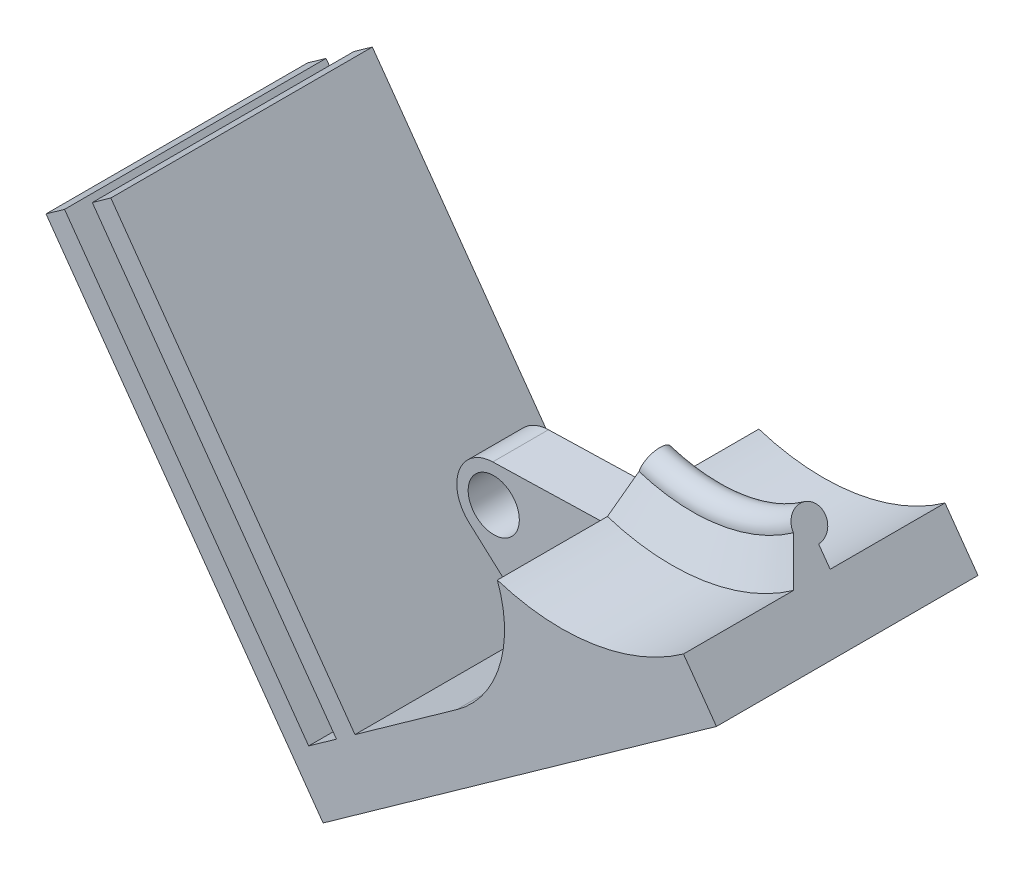
ISO-10303-21;
HEADER;
FILE_DESCRIPTION(('STEP AP214'),'2;1');
FILE_NAME('part.step','',(''),(''),'','','');
FILE_SCHEMA(('AUTOMOTIVE_DESIGN { 1 0 10303 214 1 1 1 1 }'));
ENDSEC;
DATA;
#1=APPLICATION_CONTEXT('core data for automotive mechanical design processes');
#2=APPLICATION_PROTOCOL_DEFINITION('international standard','automotive_design',2000,#1);
#3=PRODUCT_CONTEXT('',#1,'mechanical');
#4=PRODUCT('Part','Part','',(#3));
#5=PRODUCT_RELATED_PRODUCT_CATEGORY('part','',(#4));
#6=PRODUCT_DEFINITION_FORMATION('','',#4);
#7=PRODUCT_DEFINITION_CONTEXT('part definition',#1,'design');
#8=PRODUCT_DEFINITION('design','',#6,#7);
#9=PRODUCT_DEFINITION_SHAPE('','',#8);
#10=(LENGTH_UNIT() NAMED_UNIT(*) SI_UNIT(.MILLI.,.METRE.));
#11=(NAMED_UNIT(*) PLANE_ANGLE_UNIT() SI_UNIT($,.RADIAN.));
#12=(NAMED_UNIT(*) SI_UNIT($,.STERADIAN.) SOLID_ANGLE_UNIT());
#13=UNCERTAINTY_MEASURE_WITH_UNIT(LENGTH_MEASURE(1.E-05),#10,'distance_accuracy_value','');
#14=(GEOMETRIC_REPRESENTATION_CONTEXT(3) GLOBAL_UNCERTAINTY_ASSIGNED_CONTEXT((#13)) GLOBAL_UNIT_ASSIGNED_CONTEXT((#10,
#11,#12)) REPRESENTATION_CONTEXT('',''));
#15=CARTESIAN_POINT('',(0.,0.,0.));
#16=DIRECTION('',(0.,0.,1.));
#17=DIRECTION('',(1.,0.,0.));
#18=AXIS2_PLACEMENT_3D('',#15,#16,#17);
#19=CARTESIAN_POINT('',(0.,0.,23.));
#20=DIRECTION('',(0.,0.,-1.));
#21=DIRECTION('',(-1.,0.,0.));
#22=AXIS2_PLACEMENT_3D('',#19,#20,#21);
#23=CYLINDRICAL_SURFACE('',#22,37.);
#24=DIRECTION('',(0.,0.,-1.));
#25=VECTOR('',#24,1.);
#26=CARTESIAN_POINT('',(-11.2677939684122,-35.2425427443227,4.9));
#27=LINE('',#26,#25);
#28=CARTESIAN_POINT('',(-11.2677939684122,-35.2425427443227,-2.8));
#29=VERTEX_POINT('',#28);
#30=CARTESIAN_POINT('',(-11.2677939684122,-35.2425427443227,-4.9));
#31=VERTEX_POINT('',#30);
#32=EDGE_CURVE('E352',#29,#31,#27,.T.);
#33=ORIENTED_EDGE('',*,*,#32,.F.);
#34=CARTESIAN_POINT('',(0.,0.,-2.8));
#35=DIRECTION('',(0.,0.,1.));
#36=DIRECTION('',(1.,0.,0.));
#37=AXIS2_PLACEMENT_3D('',#34,#35,#36);
#38=CIRCLE('',#37,37.0000000000346);
#39=CARTESIAN_POINT('',(21.4708032995156,-30.1331147689061,-2.8));
#40=VERTEX_POINT('',#39);
#41=EDGE_CURVE('E319',#29,#40,#38,.T.);
#42=ORIENTED_EDGE('',*,*,#41,.T.);
#43=DIRECTION('',(0.,0.,-1.));
#44=VECTOR('',#43,1.);
#45=CARTESIAN_POINT('',(21.4708032994993,-30.1331147688753,23.));
#46=LINE('',#45,#44);
#47=CARTESIAN_POINT('',(21.4708032994993,-30.1331147688753,-23.));
#48=VERTEX_POINT('',#47);
#49=EDGE_CURVE('E397',#40,#48,#46,.T.);
#50=ORIENTED_EDGE('',*,*,#49,.T.);
#51=CARTESIAN_POINT('',(0.,0.,-23.));
#52=DIRECTION('',(0.,0.,1.));
#53=DIRECTION('',(1.,0.,0.));
#54=AXIS2_PLACEMENT_3D('',#51,#52,#53);
#55=CIRCLE('',#54,37.);
#56=CARTESIAN_POINT('',(-11.2677939684122,-35.2425427443227,-23.));
#57=VERTEX_POINT('',#56);
#58=EDGE_CURVE('E374',#57,#48,#55,.T.);
#59=ORIENTED_EDGE('',*,*,#58,.F.);
#60=DIRECTION('',(0.,0.,-1.));
#61=VECTOR('',#60,1.);
#62=CARTESIAN_POINT('',(-11.2677939684122,-35.2425427443227,23.));
#63=LINE('',#62,#61);
#64=EDGE_CURVE('E383',#31,#57,#63,.T.);
#65=ORIENTED_EDGE('',*,*,#64,.F.);
#66=EDGE_LOOP('',(#33,#42,#50,#59,#65));
#67=FACE_BOUND('',#66,.T.);
#68=ADVANCED_FACE('F81',(#67),#23,.F.);
#69=CARTESIAN_POINT('',(21.4708032994993,-30.1331147688753,23.));
#70=VERTEX_POINT('',#69);
#71=CARTESIAN_POINT('',(21.4708032995156,-30.1331147689061,3.63730669591681));
#72=VERTEX_POINT('',#71);
#73=EDGE_CURVE('E398',#70,#72,#46,.T.);
#74=ORIENTED_EDGE('',*,*,#73,.T.);
#75=CARTESIAN_POINT('',(0.,0.,3.63730669591681));
#76=DIRECTION('',(0.,0.,1.));
#77=DIRECTION('',(1.,0.,0.));
#78=AXIS2_PLACEMENT_3D('',#75,#76,#77);
#79=CIRCLE('',#78,37.0000000000346);
#80=CARTESIAN_POINT('',(-11.2677939684225,-35.2425427443557,3.63730669591681));
#81=VERTEX_POINT('',#80);
#82=EDGE_CURVE('E317',#81,#72,#79,.T.);
#83=ORIENTED_EDGE('',*,*,#82,.F.);
#84=CARTESIAN_POINT('',(-11.2677939684122,-35.2425427443227,4.9));
#85=VERTEX_POINT('',#84);
#86=EDGE_CURVE('E353',#85,#81,#27,.T.);
#87=ORIENTED_EDGE('',*,*,#86,.F.);
#88=CARTESIAN_POINT('',(-11.2677939684122,-35.2425427443227,23.));
#89=VERTEX_POINT('',#88);
#90=EDGE_CURVE('E394',#89,#85,#63,.T.);
#91=ORIENTED_EDGE('',*,*,#90,.F.);
#92=CARTESIAN_POINT('',(0.,0.,23.));
#93=DIRECTION('',(0.,0.,1.));
#94=DIRECTION('',(1.,0.,0.));
#95=AXIS2_PLACEMENT_3D('',#92,#93,#94);
#96=CIRCLE('',#95,37.);
#97=EDGE_CURVE('E380',#89,#70,#96,.T.);
#98=ORIENTED_EDGE('',*,*,#97,.T.);
#99=EDGE_LOOP('',(#74,#83,#87,#91,#98));
#100=FACE_BOUND('',#99,.T.);
#101=ADVANCED_FACE('F443',(#100),#23,.F.);
#102=CARTESIAN_POINT('',(-30.,-42.25,23.));
#103=DIRECTION('',(0.,0.,-1.));
#104=DIRECTION('',(-1.,0.,0.));
#105=AXIS2_PLACEMENT_3D('',#102,#103,#104);
#106=CYLINDRICAL_SURFACE('',#105,20.);
#107=DIRECTION('',(0.,0.,-1.));
#108=VECTOR('',#107,1.);
#109=CARTESIAN_POINT('',(-18.394160378649,-58.538170145338,23.));
#110=LINE('',#109,#108);
#111=CARTESIAN_POINT('',(-18.394160378649,-58.538170145338,-4.9));
#112=VERTEX_POINT('',#111);
#113=CARTESIAN_POINT('',(-18.394160378649,-58.538170145338,-23.));
#114=VERTEX_POINT('',#113);
#115=EDGE_CURVE('E89',#112,#114,#110,.T.);
#116=ORIENTED_EDGE('',*,*,#115,.F.);
#117=CARTESIAN_POINT('',(-30.,-42.25,-4.9));
#118=DIRECTION('',(0.,0.,1.));
#119=DIRECTION('',(1.,0.,0.));
#120=AXIS2_PLACEMENT_3D('',#117,#118,#119);
#121=CIRCLE('',#120,20.);
#122=EDGE_CURVE('E344',#112,#31,#121,.T.);
#123=ORIENTED_EDGE('',*,*,#122,.T.);
#124=ORIENTED_EDGE('',*,*,#64,.T.);
#125=CARTESIAN_POINT('',(-30.,-42.25,-23.));
#126=DIRECTION('',(0.,0.,1.));
#127=DIRECTION('',(1.,0.,0.));
#128=AXIS2_PLACEMENT_3D('',#125,#126,#127);
#129=CIRCLE('',#128,20.);
#130=EDGE_CURVE('E373',#114,#57,#129,.T.);
#131=ORIENTED_EDGE('',*,*,#130,.F.);
#132=EDGE_LOOP('',(#116,#123,#124,#131));
#133=FACE_BOUND('',#132,.T.);
#134=ADVANCED_FACE('F405',(#133),#106,.F.);
#135=CARTESIAN_POINT('',(-30.,-42.25,4.9));
#136=DIRECTION('',(0.,0.,1.));
#137=DIRECTION('',(1.,0.,0.));
#138=AXIS2_PLACEMENT_3D('',#135,#136,#137);
#139=CIRCLE('',#138,20.);
#140=CARTESIAN_POINT('',(-18.394160378649,-58.538170145338,4.9));
#141=VERTEX_POINT('',#140);
#142=EDGE_CURVE('E332',#141,#85,#139,.T.);
#143=ORIENTED_EDGE('',*,*,#142,.F.);
#144=CARTESIAN_POINT('',(-18.394160378649,-58.538170145338,23.));
#145=VERTEX_POINT('',#144);
#146=EDGE_CURVE('E12',#145,#141,#110,.T.);
#147=ORIENTED_EDGE('',*,*,#146,.F.);
#148=CARTESIAN_POINT('',(-30.,-42.25,23.));
#149=DIRECTION('',(0.,0.,1.));
#150=DIRECTION('',(1.,0.,0.));
#151=AXIS2_PLACEMENT_3D('',#148,#149,#150);
#152=CIRCLE('',#151,20.);
#153=EDGE_CURVE('E235',#145,#89,#152,.T.);
#154=ORIENTED_EDGE('',*,*,#153,.T.);
#155=ORIENTED_EDGE('',*,*,#90,.T.);
#156=EDGE_LOOP('',(#143,#147,#154,#155));
#157=FACE_BOUND('',#156,.T.);
#158=ADVANCED_FACE('F83',(#157),#106,.F.);
#159=CARTESIAN_POINT('',(21.4708032994993,-30.1331147688753,23.));
#160=DIRECTION('',(-0.58029198106755,0.814408507266899,0.));
#161=DIRECTION('',(-0.814408507266899,-0.58029198106755,0.));
#162=AXIS2_PLACEMENT_3D('',#159,#160,#161);
#163=PLANE('',#162);
#164=DIRECTION('',(0.814408507266899,0.58029198106755,0.));
#165=VECTOR('',#164,1.);
#166=CARTESIAN_POINT('',(21.4708032994993,-30.1331147688753,-23.));
#167=LINE('',#166,#165);
#168=CARTESIAN_POINT('',(-36.3111475385208,-71.3045937288241,-23.));
#169=VERTEX_POINT('',#168);
#170=EDGE_CURVE('E243',#169,#114,#167,.T.);
#171=ORIENTED_EDGE('',*,*,#170,.F.);
#172=DIRECTION('',(0.,0.,-1.));
#173=VECTOR('',#172,1.);
#174=CARTESIAN_POINT('',(-36.3111475385208,-71.3045937288241,23.));
#175=LINE('',#174,#173);
#176=CARTESIAN_POINT('',(-36.3111475385208,-71.3045937288241,23.));
#177=VERTEX_POINT('',#176);
#178=EDGE_CURVE('E240',#177,#169,#175,.T.);
#179=ORIENTED_EDGE('',*,*,#178,.F.);
#180=DIRECTION('',(0.814408507266899,0.58029198106755,0.));
#181=VECTOR('',#180,1.);
#182=CARTESIAN_POINT('',(21.4708032994993,-30.1331147688753,23.));
#183=LINE('',#182,#181);
#184=EDGE_CURVE('E226',#177,#145,#183,.T.);
#185=ORIENTED_EDGE('',*,*,#184,.T.);
#186=ORIENTED_EDGE('',*,*,#146,.T.);
#187=DIRECTION('',(0.,0.,-1.));
#188=VECTOR('',#187,1.);
#189=CARTESIAN_POINT('',(-18.394160378649,-58.538170145338,4.9));
#190=LINE('',#189,#188);
#191=EDGE_CURVE('E360',#112,#141,#190,.F.);
#192=ORIENTED_EDGE('',*,*,#191,.F.);
#193=ORIENTED_EDGE('',*,*,#115,.T.);
#194=EDGE_LOOP('',(#171,#179,#185,#186,#192,#193));
#195=FACE_BOUND('',#194,.T.);
#196=ADVANCED_FACE('F241',(#195),#163,.T.);
#197=CARTESIAN_POINT('',(27.2737231101748,-38.2771998415442,23.));
#198=DIRECTION('',(0.58029198106755,-0.814408507266899,0.));
#199=DIRECTION('',(0.814408507266899,0.58029198106755,0.));
#200=AXIS2_PLACEMENT_3D('',#197,#198,#199);
#201=PLANE('',#200);
#202=DIRECTION('',(-0.814408507266899,-0.58029198106755,0.));
#203=VECTOR('',#202,1.);
#204=CARTESIAN_POINT('',(27.2737231101748,-38.2771998415442,-23.));
#205=LINE('',#204,#203);
#206=CARTESIAN_POINT('',(27.2737231101748,-38.2771998415442,-23.));
#207=VERTEX_POINT('',#206);
#208=CARTESIAN_POINT('',(-41.9099468295753,-87.572766536448,-23.));
#209=VERTEX_POINT('',#208);
#210=EDGE_CURVE('E387',#207,#209,#205,.T.);
#211=ORIENTED_EDGE('',*,*,#210,.F.);
#212=DIRECTION('',(0.,0.,-1.));
#213=VECTOR('',#212,1.);
#214=CARTESIAN_POINT('',(27.2737231101748,-38.2771998415442,23.));
#215=LINE('',#214,#213);
#216=CARTESIAN_POINT('',(27.2737231101748,-38.2771998415442,23.));
#217=VERTEX_POINT('',#216);
#218=EDGE_CURVE('E400',#217,#207,#215,.T.);
#219=ORIENTED_EDGE('',*,*,#218,.F.);
#220=DIRECTION('',(-0.814408507266899,-0.58029198106755,0.));
#221=VECTOR('',#220,1.);
#222=CARTESIAN_POINT('',(27.2737231101748,-38.2771998415442,23.));
#223=LINE('',#222,#221);
#224=CARTESIAN_POINT('',(-41.9099468295753,-87.572766536448,23.));
#225=VERTEX_POINT('',#224);
#226=EDGE_CURVE('E237',#217,#225,#223,.T.);
#227=ORIENTED_EDGE('',*,*,#226,.T.);
#228=DIRECTION('',(0.,0.,-1.));
#229=VECTOR('',#228,1.);
#230=CARTESIAN_POINT('',(-41.9099468295753,-87.572766536448,23.));
#231=LINE('',#230,#229);
#232=EDGE_CURVE('E273',#225,#209,#231,.T.);
#233=ORIENTED_EDGE('',*,*,#232,.T.);
#234=EDGE_LOOP('',(#211,#219,#227,#233));
#235=FACE_BOUND('',#234,.T.);
#236=ADVANCED_FACE('F501',(#235),#201,.T.);
#237=CARTESIAN_POINT('',(0.,0.,23.));
#238=DIRECTION('',(0.814408507266898,0.580291981067551,0.));
#239=DIRECTION('',(-0.580291981067551,0.814408507266898,0.));
#240=AXIS2_PLACEMENT_3D('',#237,#238,#239);
#241=PLANE('',#240);
#242=DIRECTION('',(0.580291981067551,-0.814408507266898,0.));
#243=VECTOR('',#242,1.);
#244=CARTESIAN_POINT('',(0.,0.,-23.));
#245=LINE('',#244,#243);
#246=EDGE_CURVE('E389',#48,#207,#245,.T.);
#247=ORIENTED_EDGE('',*,*,#246,.F.);
#248=ORIENTED_EDGE('',*,*,#49,.F.);
#249=DIRECTION('',(0.580291981067551,-0.814408507266898,0.));
#250=VECTOR('',#249,1.);
#251=CARTESIAN_POINT('',(-3.86665141763233E-12,-2.75429890737241E-12,-2.79999999999999));
#252=LINE('',#251,#250);
#253=CARTESIAN_POINT('',(19.4397813657681,-27.2826849934395,-2.8));
#254=VERTEX_POINT('',#253);
#255=EDGE_CURVE('E306',#254,#40,#252,.T.);
#256=ORIENTED_EDGE('',*,*,#255,.F.);
#257=CARTESIAN_POINT('',(17.8149638187738,-25.0023411730938,-2.8));
#258=DIRECTION('',(0.814408507266898,0.580291981067551,0.));
#259=DIRECTION('',(-0.580291981067551,0.814408507266898,0.));
#260=AXIS2_PLACEMENT_3D('',#257,#258,#259);
#261=CIRCLE('',#260,2.8);
#262=CARTESIAN_POINT('',(17.814963818775,-25.0023411730951,0.));
#263=VERTEX_POINT('',#262);
#264=EDGE_CURVE('E247',#254,#263,#261,.T.);
#265=ORIENTED_EDGE('',*,*,#264,.T.);
#266=DIRECTION('',(-0.502547597216898,0.705298456351299,-0.499999999999998));
#267=VECTOR('',#266,1.);
#268=CARTESIAN_POINT('',(4.45374095468898,-6.25058529327534,-13.2934899480894));
#269=LINE('',#268,#267);
#270=EDGE_CURVE('E303',#72,#263,#269,.T.);
#271=ORIENTED_EDGE('',*,*,#270,.F.);
#272=ORIENTED_EDGE('',*,*,#73,.F.);
#273=DIRECTION('',(0.580291981067551,-0.814408507266898,0.));
#274=VECTOR('',#273,1.);
#275=CARTESIAN_POINT('',(0.,0.,23.));
#276=LINE('',#275,#274);
#277=EDGE_CURVE('E377',#70,#217,#276,.T.);
#278=ORIENTED_EDGE('',*,*,#277,.T.);
#279=ORIENTED_EDGE('',*,*,#218,.T.);
#280=EDGE_LOOP('',(#247,#248,#256,#265,#271,#272,#278,#279));
#281=FACE_BOUND('',#280,.T.);
#282=ADVANCED_FACE('F439',(#281),#241,.T.);
#283=CARTESIAN_POINT('',(0.,0.,23.));
#284=DIRECTION('',(0.,0.,1.));
#285=DIRECTION('',(1.,0.,0.));
#286=AXIS2_PLACEMENT_3D('',#283,#284,#285);
#287=PLANE('',#286);
#288=ORIENTED_EDGE('',*,*,#153,.F.);
#289=ORIENTED_EDGE('',*,*,#184,.F.);
#290=DIRECTION('',(-0.58029198106836,0.814408507266322,0.));
#291=VECTOR('',#290,1.);
#292=CARTESIAN_POINT('',(-57.7819508380172,-41.1714789600334,23.));
#293=LINE('',#292,#291);
#294=CARTESIAN_POINT('',(-79.2527541375474,-11.0383641911783,23.));
#295=VERTEX_POINT('',#294);
#296=EDGE_CURVE('E231',#177,#295,#293,.T.);
#297=ORIENTED_EDGE('',*,*,#296,.T.);
#298=DIRECTION('',(0.8144085072664,0.58029198106825,0.));
#299=VECTOR('',#298,1.);
#300=CARTESIAN_POINT('',(-21.4708032995206,30.1331147688502,23.));
#301=LINE('',#300,#299);
#302=CARTESIAN_POINT('',(-82.5103881665451,-13.3595321154029,23.));
#303=VERTEX_POINT('',#302);
#304=EDGE_CURVE('E252',#303,#295,#301,.T.);
#305=ORIENTED_EDGE('',*,*,#304,.F.);
#306=DIRECTION('',(-0.580291981067551,0.814408507266898,0.));
#307=VECTOR('',#306,1.);
#308=CARTESIAN_POINT('',(-61.0395848670877,-43.4926468842192,23.));
#309=LINE('',#308,#307);
#310=CARTESIAN_POINT('',(-39.5687815675884,-73.6257616530943,23.));
#311=VERTEX_POINT('',#310);
#312=EDGE_CURVE('E255',#311,#303,#309,.T.);
#313=ORIENTED_EDGE('',*,*,#312,.F.);
#314=DIRECTION('',(-0.814408507266899,-0.58029198106755,0.));
#315=VECTOR('',#314,1.);
#316=CARTESIAN_POINT('',(21.4708032994993,-30.1331147688753,23.));
#317=LINE('',#316,#315);
#318=CARTESIAN_POINT('',(-44.4552326111898,-77.1075135394996,23.));
#319=VERTEX_POINT('',#318);
#320=EDGE_CURVE('E263',#311,#319,#317,.T.);
#321=ORIENTED_EDGE('',*,*,#320,.T.);
#322=DIRECTION('',(-0.580291981067551,0.814408507266898,0.));
#323=VECTOR('',#322,1.);
#324=CARTESIAN_POINT('',(-65.9260359106891,-46.9743987706245,23.));
#325=LINE('',#324,#323);
#326=CARTESIAN_POINT('',(-87.3968392101435,-16.8412840018124,23.));
#327=VERTEX_POINT('',#326);
#328=EDGE_CURVE('E265',#319,#327,#325,.T.);
#329=ORIENTED_EDGE('',*,*,#328,.T.);
#330=DIRECTION('',(0.8144085072664,0.58029198106825,0.));
#331=VECTOR('',#330,1.);
#332=CARTESIAN_POINT('',(-21.4708032995206,30.1331147688502,23.));
#333=LINE('',#332,#331);
#334=CARTESIAN_POINT('',(-90.6544732392714,-19.1624519261298,23.));
#335=VERTEX_POINT('',#334);
#336=EDGE_CURVE('E267',#335,#327,#333,.T.);
#337=ORIENTED_EDGE('',*,*,#336,.F.);
#338=DIRECTION('',(0.580291981067551,-0.814408507266898,0.));
#339=VECTOR('',#338,1.);
#340=CARTESIAN_POINT('',(-69.1836699397567,-49.2955666948946,23.));
#341=LINE('',#340,#339);
#342=EDGE_CURVE('E270',#335,#225,#341,.T.);
#343=ORIENTED_EDGE('',*,*,#342,.T.);
#344=ORIENTED_EDGE('',*,*,#226,.F.);
#345=ORIENTED_EDGE('',*,*,#277,.F.);
#346=ORIENTED_EDGE('',*,*,#97,.F.);
#347=EDGE_LOOP('',(#288,#289,#297,#305,#313,#321,#329,#337,#343,#344,#345,#346));
#348=FACE_BOUND('',#347,.T.);
#349=ADVANCED_FACE('F228',(#348),#287,.T.);
#350=CARTESIAN_POINT('',(0.,0.,-23.));
#351=DIRECTION('',(0.,0.,1.));
#352=DIRECTION('',(1.,0.,0.));
#353=AXIS2_PLACEMENT_3D('',#350,#351,#352);
#354=PLANE('',#353);
#355=ORIENTED_EDGE('',*,*,#130,.T.);
#356=ORIENTED_EDGE('',*,*,#58,.T.);
#357=ORIENTED_EDGE('',*,*,#246,.T.);
#358=ORIENTED_EDGE('',*,*,#210,.T.);
#359=DIRECTION('',(0.580291981067551,-0.814408507266898,0.));
#360=VECTOR('',#359,1.);
#361=CARTESIAN_POINT('',(-69.1836699397567,-49.2955666948946,-23.));
#362=LINE('',#361,#360);
#363=CARTESIAN_POINT('',(-90.6544732392714,-19.1624519261298,-23.));
#364=VERTEX_POINT('',#363);
#365=EDGE_CURVE('E253',#364,#209,#362,.T.);
#366=ORIENTED_EDGE('',*,*,#365,.F.);
#367=DIRECTION('',(0.8144085072664,0.58029198106825,0.));
#368=VECTOR('',#367,1.);
#369=CARTESIAN_POINT('',(-21.4708032995206,30.1331147688502,-23.));
#370=LINE('',#369,#368);
#371=CARTESIAN_POINT('',(-87.3968392101435,-16.8412840018124,-23.));
#372=VERTEX_POINT('',#371);
#373=EDGE_CURVE('E258',#364,#372,#370,.T.);
#374=ORIENTED_EDGE('',*,*,#373,.T.);
#375=DIRECTION('',(-0.580291981067551,0.814408507266898,0.));
#376=VECTOR('',#375,1.);
#377=CARTESIAN_POINT('',(-65.9260359106891,-46.9743987706245,-23.));
#378=LINE('',#377,#376);
#379=CARTESIAN_POINT('',(-44.4552326111898,-77.1075135394996,-23.));
#380=VERTEX_POINT('',#379);
#381=EDGE_CURVE('E284',#380,#372,#378,.T.);
#382=ORIENTED_EDGE('',*,*,#381,.F.);
#383=DIRECTION('',(-0.814408507266899,-0.58029198106755,0.));
#384=VECTOR('',#383,1.);
#385=CARTESIAN_POINT('',(21.4708032994993,-30.1331147688753,-23.));
#386=LINE('',#385,#384);
#387=CARTESIAN_POINT('',(-39.5687815675884,-73.6257616530943,-23.));
#388=VERTEX_POINT('',#387);
#389=EDGE_CURVE('E282',#388,#380,#386,.T.);
#390=ORIENTED_EDGE('',*,*,#389,.F.);
#391=DIRECTION('',(-0.580291981067551,0.814408507266898,0.));
#392=VECTOR('',#391,1.);
#393=CARTESIAN_POINT('',(-61.0395848670877,-43.4926468842192,-23.));
#394=LINE('',#393,#392);
#395=CARTESIAN_POINT('',(-82.5103881665451,-13.3595321154029,-23.));
#396=VERTEX_POINT('',#395);
#397=EDGE_CURVE('E279',#388,#396,#394,.T.);
#398=ORIENTED_EDGE('',*,*,#397,.T.);
#399=DIRECTION('',(0.8144085072664,0.58029198106825,0.));
#400=VECTOR('',#399,1.);
#401=CARTESIAN_POINT('',(-21.4708032995206,30.1331147688502,-23.));
#402=LINE('',#401,#400);
#403=CARTESIAN_POINT('',(-79.2527541375474,-11.0383641911783,-23.));
#404=VERTEX_POINT('',#403);
#405=EDGE_CURVE('E276',#396,#404,#402,.T.);
#406=ORIENTED_EDGE('',*,*,#405,.T.);
#407=DIRECTION('',(-0.58029198106836,0.814408507266322,0.));
#408=VECTOR('',#407,1.);
#409=CARTESIAN_POINT('',(-57.7819508380172,-41.1714789600334,-23.));
#410=LINE('',#409,#408);
#411=EDGE_CURVE('E274',#169,#404,#410,.T.);
#412=ORIENTED_EDGE('',*,*,#411,.F.);
#413=ORIENTED_EDGE('',*,*,#170,.T.);
#414=EDGE_LOOP('',(#355,#356,#357,#358,#366,#374,#382,#390,#398,#406,#412,#413));
#415=FACE_BOUND('',#414,.T.);
#416=ADVANCED_FACE('F409',(#415),#354,.F.);
#417=CARTESIAN_POINT('',(-30.,-42.25,4.9));
#418=DIRECTION('',(0.,0.,-1.));
#419=DIRECTION('',(-1.,0.,0.));
#420=AXIS2_PLACEMENT_3D('',#417,#418,#419);
#421=CYLINDRICAL_SURFACE('',#420,20.);
#422=CARTESIAN_POINT('',(-20.2980587037138,-59.7392062450935,-4.9));
#423=VERTEX_POINT('',#422);
#424=EDGE_CURVE('E346',#423,#112,#121,.T.);
#425=ORIENTED_EDGE('',*,*,#424,.T.);
#426=ORIENTED_EDGE('',*,*,#191,.T.);
#427=CARTESIAN_POINT('',(-20.2980587037138,-59.7392062450935,4.9));
#428=VERTEX_POINT('',#427);
#429=EDGE_CURVE('E334',#428,#141,#139,.T.);
#430=ORIENTED_EDGE('',*,*,#429,.F.);
#431=DIRECTION('',(0.,0.,-1.));
#432=VECTOR('',#431,1.);
#433=CARTESIAN_POINT('',(-20.2980587037138,-59.7392062450935,4.9));
#434=LINE('',#433,#432);
#435=EDGE_CURVE('E356',#428,#423,#434,.T.);
#436=ORIENTED_EDGE('',*,*,#435,.T.);
#437=EDGE_LOOP('',(#425,#426,#430,#436));
#438=FACE_BOUND('',#437,.T.);
#439=ADVANCED_FACE('F448',(#438),#421,.T.);
#440=CARTESIAN_POINT('',(-38.8013302307998,-43.0696653127729,4.9));
#441=DIRECTION('',(-0.669332827643123,-0.742962694783029,0.));
#442=DIRECTION('',(0.742962694783029,-0.669332827643123,0.));
#443=AXIS2_PLACEMENT_3D('',#440,#441,#442);
#444=PLANE('',#443);
#445=DIRECTION('',(-0.742962694783029,0.669332827643123,0.));
#446=VECTOR('',#445,1.);
#447=CARTESIAN_POINT('',(-38.8013302307998,-43.0696653127729,-4.9));
#448=LINE('',#447,#446);
#449=CARTESIAN_POINT('',(-34.3506633796803,-47.0792575160897,-4.9));
#450=VERTEX_POINT('',#449);
#451=EDGE_CURVE('E341',#423,#450,#448,.T.);
#452=ORIENTED_EDGE('',*,*,#451,.F.);
#453=ORIENTED_EDGE('',*,*,#435,.F.);
#454=DIRECTION('',(-0.742962694783029,0.669332827643123,0.));
#455=VECTOR('',#454,1.);
#456=CARTESIAN_POINT('',(-38.8013302307998,-43.0696653127729,4.9));
#457=LINE('',#456,#455);
#458=CARTESIAN_POINT('',(-34.3506633796803,-47.0792575160897,4.9));
#459=VERTEX_POINT('',#458);
#460=EDGE_CURVE('E329',#428,#459,#457,.T.);
#461=ORIENTED_EDGE('',*,*,#460,.T.);
#462=DIRECTION('',(0.,0.,-1.));
#463=VECTOR('',#462,1.);
#464=CARTESIAN_POINT('',(-34.3506633796803,-47.0792575160897,4.9));
#465=LINE('',#464,#463);
#466=EDGE_CURVE('E358',#459,#450,#465,.T.);
#467=ORIENTED_EDGE('',*,*,#466,.T.);
#468=EDGE_LOOP('',(#452,#453,#461,#467));
#469=FACE_BOUND('',#468,.T.);
#470=ADVANCED_FACE('F458',(#469),#444,.T.);
#471=CARTESIAN_POINT('',(0.941402305752511,-34.9133342695565,4.9));
#472=DIRECTION('',(0.0269541791365419,-0.999636670109233,0.));
#473=DIRECTION('',(0.999636670109233,0.0269541791365419,0.));
#474=AXIS2_PLACEMENT_3D('',#471,#472,#473);
#475=PLANE('',#474);
#476=DIRECTION('',(-0.999636670109233,-0.0269541791365419,0.));
#477=VECTOR('',#476,1.);
#478=CARTESIAN_POINT('',(0.941402305752511,-34.9133342695565,-4.9));
#479=LINE('',#478,#477);
#480=CARTESIAN_POINT('',(-30.1752021643875,-35.75236164429,-4.9));
#481=VERTEX_POINT('',#480);
#482=EDGE_CURVE('E333',#31,#481,#479,.T.);
#483=ORIENTED_EDGE('',*,*,#482,.T.);
#484=DIRECTION('',(0.,0.,-1.));
#485=VECTOR('',#484,1.);
#486=CARTESIAN_POINT('',(-30.1752021643875,-35.75236164429,4.9));
#487=LINE('',#486,#485);
#488=CARTESIAN_POINT('',(-30.1752021643875,-35.75236164429,4.9));
#489=VERTEX_POINT('',#488);
#490=EDGE_CURVE('E340',#489,#481,#487,.T.);
#491=ORIENTED_EDGE('',*,*,#490,.F.);
#492=DIRECTION('',(-0.999636670109233,-0.0269541791365419,0.));
#493=VECTOR('',#492,1.);
#494=CARTESIAN_POINT('',(0.941402305752511,-34.9133342695565,4.9));
#495=LINE('',#494,#493);
#496=EDGE_CURVE('E337',#85,#489,#495,.T.);
#497=ORIENTED_EDGE('',*,*,#496,.F.);
#498=ORIENTED_EDGE('',*,*,#86,.T.);
#499=DIRECTION('',(0.,0.,1.));
#500=VECTOR('',#499,1.);
#501=CARTESIAN_POINT('',(-11.2677939684225,-35.2425427443557,0.));
#502=LINE('',#501,#500);
#503=EDGE_CURVE('E312',#29,#81,#502,.T.);
#504=ORIENTED_EDGE('',*,*,#503,.F.);
#505=ORIENTED_EDGE('',*,*,#32,.T.);
#506=EDGE_LOOP('',(#483,#491,#497,#498,#504,#505));
#507=FACE_BOUND('',#506,.T.);
#508=ADVANCED_FACE('F465',(#507),#475,.F.);
#509=CARTESIAN_POINT('',(0.,0.,-4.9));
#510=DIRECTION('',(0.,0.,1.));
#511=DIRECTION('',(1.,0.,0.));
#512=AXIS2_PLACEMENT_3D('',#509,#510,#511);
#513=PLANE('',#512);
#514=ORIENTED_EDGE('',*,*,#451,.T.);
#515=CARTESIAN_POINT('',(-30.,-42.25,-4.9));
#516=DIRECTION('',(0.,0.,1.));
#517=DIRECTION('',(1.,0.,0.));
#518=AXIS2_PLACEMENT_3D('',#515,#516,#517);
#519=CIRCLE('',#518,6.5);
#520=EDGE_CURVE('E364',#481,#450,#519,.T.);
#521=ORIENTED_EDGE('',*,*,#520,.F.);
#522=ORIENTED_EDGE('',*,*,#482,.F.);
#523=ORIENTED_EDGE('',*,*,#122,.F.);
#524=ORIENTED_EDGE('',*,*,#424,.F.);
#525=EDGE_LOOP('',(#514,#521,#522,#523,#524));
#526=FACE_BOUND('',#525,.T.);
#527=CARTESIAN_POINT('',(-30.,-42.25,-4.9));
#528=DIRECTION('',(0.,0.,1.));
#529=DIRECTION('',(1.,0.,0.));
#530=AXIS2_PLACEMENT_3D('',#527,#528,#529);
#531=CIRCLE('',#530,4.50000000000001);
#532=CARTESIAN_POINT('',(-25.5,-42.25,-4.9));
#533=VERTEX_POINT('',#532);
#534=EDGE_CURVE('E324',#533,#533,#531,.T.);
#535=ORIENTED_EDGE('',*,*,#534,.T.);
#536=EDGE_LOOP('',(#535));
#537=FACE_BOUND('',#536,.T.);
#538=ADVANCED_FACE('F460',(#526,#537),#513,.F.);
#539=CARTESIAN_POINT('',(0.,0.,4.9));
#540=DIRECTION('',(0.,0.,1.));
#541=DIRECTION('',(1.,0.,0.));
#542=AXIS2_PLACEMENT_3D('',#539,#540,#541);
#543=PLANE('',#542);
#544=ORIENTED_EDGE('',*,*,#496,.T.);
#545=CARTESIAN_POINT('',(-30.,-42.25,4.9));
#546=DIRECTION('',(0.,0.,1.));
#547=DIRECTION('',(1.,0.,0.));
#548=AXIS2_PLACEMENT_3D('',#545,#546,#547);
#549=CIRCLE('',#548,6.5);
#550=EDGE_CURVE('E345',#489,#459,#549,.T.);
#551=ORIENTED_EDGE('',*,*,#550,.T.);
#552=ORIENTED_EDGE('',*,*,#460,.F.);
#553=ORIENTED_EDGE('',*,*,#429,.T.);
#554=ORIENTED_EDGE('',*,*,#142,.T.);
#555=EDGE_LOOP('',(#544,#551,#552,#553,#554));
#556=FACE_BOUND('',#555,.T.);
#557=CARTESIAN_POINT('',(-30.,-42.25,4.9));
#558=DIRECTION('',(0.,0.,1.));
#559=DIRECTION('',(1.,0.,0.));
#560=AXIS2_PLACEMENT_3D('',#557,#558,#559);
#561=CIRCLE('',#560,4.50000000000001);
#562=CARTESIAN_POINT('',(-25.5,-42.25,4.9));
#563=VERTEX_POINT('',#562);
#564=EDGE_CURVE('E361',#563,#563,#561,.T.);
#565=ORIENTED_EDGE('',*,*,#564,.F.);
#566=EDGE_LOOP('',(#565));
#567=FACE_BOUND('',#566,.T.);
#568=ADVANCED_FACE('F452',(#556,#567),#543,.T.);
#569=CARTESIAN_POINT('',(-30.,-42.25,4.9));
#570=DIRECTION('',(0.,0.,-1.));
#571=DIRECTION('',(-1.,0.,0.));
#572=AXIS2_PLACEMENT_3D('',#569,#570,#571);
#573=CYLINDRICAL_SURFACE('',#572,4.50000000000001);
#574=ORIENTED_EDGE('',*,*,#564,.T.);
#575=EDGE_LOOP('',(#574));
#576=FACE_BOUND('',#575,.T.);
#577=ORIENTED_EDGE('',*,*,#534,.F.);
#578=EDGE_LOOP('',(#577));
#579=FACE_BOUND('',#578,.T.);
#580=ADVANCED_FACE('F486',(#576,#579),#573,.F.);
#581=CARTESIAN_POINT('',(-30.,-42.25,4.9));
#582=DIRECTION('',(0.,0.,-1.));
#583=DIRECTION('',(-1.,0.,0.));
#584=AXIS2_PLACEMENT_3D('',#581,#582,#583);
#585=CYLINDRICAL_SURFACE('',#584,6.5);
#586=ORIENTED_EDGE('',*,*,#520,.T.);
#587=ORIENTED_EDGE('',*,*,#466,.F.);
#588=ORIENTED_EDGE('',*,*,#550,.F.);
#589=ORIENTED_EDGE('',*,*,#490,.T.);
#590=EDGE_LOOP('',(#586,#587,#588,#589));
#591=FACE_BOUND('',#590,.T.);
#592=ADVANCED_FACE('F565',(#591),#585,.T.);
#593=CARTESIAN_POINT('',(-4.52163691385766E-12,1.44635931769073E-12,-2.8));
#594=DIRECTION('',(0.,0.,1.));
#595=DIRECTION('',(1.,0.,0.));
#596=AXIS2_PLACEMENT_3D('',#593,#594,#595);
#597=PLANE('',#596);
#598=ORIENTED_EDGE('',*,*,#41,.F.);
#599=DIRECTION('',(-0.30453497211912,-0.952501155252007,0.));
#600=VECTOR('',#599,1.);
#601=CARTESIAN_POINT('',(-4.52163691385766E-12,1.44635931769073E-12,-2.79999999999999));
#602=LINE('',#601,#600);
#603=CARTESIAN_POINT('',(-10.2019215659861,-31.9087887009454,-2.8));
#604=VERTEX_POINT('',#603);
#605=EDGE_CURVE('E96',#604,#29,#602,.T.);
#606=ORIENTED_EDGE('',*,*,#605,.F.);
#607=CARTESIAN_POINT('',(0.,0.,-2.8));
#608=DIRECTION('',(0.,0.,1.));
#609=DIRECTION('',(1.,0.,0.));
#610=AXIS2_PLACEMENT_3D('',#607,#608,#609);
#611=CIRCLE('',#610,33.5000000000017);
#612=EDGE_CURVE('E322',#604,#254,#611,.T.);
#613=ORIENTED_EDGE('',*,*,#612,.T.);
#614=ORIENTED_EDGE('',*,*,#255,.T.);
#615=EDGE_LOOP('',(#598,#606,#613,#614));
#616=FACE_BOUND('',#615,.T.);
#617=ADVANCED_FACE('F473',(#616),#597,.F.);
#618=CARTESIAN_POINT('',(0.,0.,3.63730669591681));
#619=DIRECTION('',(0.,0.,1.));
#620=DIRECTION('',(1.,0.,0.));
#621=AXIS2_PLACEMENT_3D('',#618,#619,#620);
#622=CONICAL_SURFACE('',#621,37.0000000000346,1.04719755119622);
#623=DIRECTION('',(0.263735022195944,0.824890197582265,-0.499999999999998));
#624=VECTOR('',#623,1.);
#625=CARTESIAN_POINT('',(-2.33730591101845,-7.31044636655671,-13.2934899480894));
#626=LINE('',#625,#624);
#627=CARTESIAN_POINT('',(-9.34922364405731,-29.2417854662383,0.));
#628=VERTEX_POINT('',#627);
#629=EDGE_CURVE('E309',#81,#628,#626,.T.);
#630=ORIENTED_EDGE('',*,*,#629,.F.);
#631=ORIENTED_EDGE('',*,*,#82,.T.);
#632=ORIENTED_EDGE('',*,*,#270,.T.);
#633=CARTESIAN_POINT('',(0.,0.,0.));
#634=DIRECTION('',(0.,0.,1.));
#635=DIRECTION('',(1.,0.,0.));
#636=AXIS2_PLACEMENT_3D('',#633,#634,#635);
#637=CIRCLE('',#636,30.7000000000017);
#638=EDGE_CURVE('E315',#628,#263,#637,.T.);
#639=ORIENTED_EDGE('',*,*,#638,.F.);
#640=EDGE_LOOP('',(#630,#631,#632,#639));
#641=FACE_BOUND('',#640,.T.);
#642=ADVANCED_FACE('F477',(#641),#622,.F.);
#643=CARTESIAN_POINT('',(-4.52198667086879E-12,1.44577576325533E-12,0.));
#644=DIRECTION('',(0.952501155252007,-0.30453497211912,0.));
#645=DIRECTION('',(0.30453497211912,0.952501155252007,0.));
#646=AXIS2_PLACEMENT_3D('',#643,#644,#645);
#647=PLANE('',#646);
#648=ORIENTED_EDGE('',*,*,#629,.T.);
#649=CARTESIAN_POINT('',(-9.34922364405697,-29.2417854662366,-2.8));
#650=DIRECTION('',(0.952501155252007,-0.30453497211912,0.));
#651=DIRECTION('',(0.30453497211912,0.952501155252007,0.));
#652=AXIS2_PLACEMENT_3D('',#649,#650,#651);
#653=CIRCLE('',#652,2.8);
#654=EDGE_CURVE('E307',#604,#628,#653,.T.);
#655=ORIENTED_EDGE('',*,*,#654,.F.);
#656=ORIENTED_EDGE('',*,*,#605,.T.);
#657=ORIENTED_EDGE('',*,*,#503,.T.);
#658=EDGE_LOOP('',(#648,#655,#656,#657));
#659=FACE_BOUND('',#658,.T.);
#660=ADVANCED_FACE('F478',(#659),#647,.F.);
#661=CARTESIAN_POINT('',(0.,0.,-2.8));
#662=DIRECTION('',(0.,0.,1.));
#663=DIRECTION('',(1.,0.,0.));
#664=AXIS2_PLACEMENT_3D('',#661,#662,#663);
#665=TOROIDAL_SURFACE('',#664,30.7,2.8);
#666=ORIENTED_EDGE('',*,*,#612,.F.);
#667=ORIENTED_EDGE('',*,*,#654,.T.);
#668=ORIENTED_EDGE('',*,*,#638,.T.);
#669=ORIENTED_EDGE('',*,*,#264,.F.);
#670=EDGE_LOOP('',(#666,#667,#668,#669));
#671=FACE_BOUND('',#670,.T.);
#672=ADVANCED_FACE('F475',(#671),#665,.T.);
#673=CARTESIAN_POINT('',(-57.7819508380172,-41.1714789600334,23.));
#674=DIRECTION('',(-0.814408507266322,-0.580291981068359,0.));
#675=DIRECTION('',(0.580291981068359,-0.814408507266322,0.));
#676=AXIS2_PLACEMENT_3D('',#673,#674,#675);
#677=PLANE('',#676);
#678=ORIENTED_EDGE('',*,*,#411,.T.);
#679=DIRECTION('',(0.,0.,-1.));
#680=VECTOR('',#679,1.);
#681=CARTESIAN_POINT('',(-79.2527541375474,-11.0383641911783,23.));
#682=LINE('',#681,#680);
#683=EDGE_CURVE('E248',#295,#404,#682,.T.);
#684=ORIENTED_EDGE('',*,*,#683,.F.);
#685=ORIENTED_EDGE('',*,*,#296,.F.);
#686=ORIENTED_EDGE('',*,*,#178,.T.);
#687=EDGE_LOOP('',(#678,#684,#685,#686));
#688=FACE_BOUND('',#687,.T.);
#689=ADVANCED_FACE('F250',(#688),#677,.F.);
#690=CARTESIAN_POINT('',(-21.4708032995206,30.1331147688502,23.));
#691=DIRECTION('',(-0.58029198106825,0.8144085072664,0.));
#692=DIRECTION('',(-0.8144085072664,-0.58029198106825,0.));
#693=AXIS2_PLACEMENT_3D('',#690,#691,#692);
#694=PLANE('',#693);
#695=ORIENTED_EDGE('',*,*,#405,.F.);
#696=DIRECTION('',(0.,0.,-1.));
#697=VECTOR('',#696,1.);
#698=CARTESIAN_POINT('',(-82.5103881665451,-13.3595321154029,23.));
#699=LINE('',#698,#697);
#700=EDGE_CURVE('E300',#303,#396,#699,.T.);
#701=ORIENTED_EDGE('',*,*,#700,.F.);
#702=ORIENTED_EDGE('',*,*,#304,.T.);
#703=ORIENTED_EDGE('',*,*,#683,.T.);
#704=EDGE_LOOP('',(#695,#701,#702,#703));
#705=FACE_BOUND('',#704,.T.);
#706=ADVANCED_FACE('F414',(#705),#694,.T.);
#707=CARTESIAN_POINT('',(-61.0395848670877,-43.4926468842192,23.));
#708=DIRECTION('',(-0.814408507266898,-0.580291981067551,0.));
#709=DIRECTION('',(0.580291981067551,-0.814408507266898,0.));
#710=AXIS2_PLACEMENT_3D('',#707,#708,#709);
#711=PLANE('',#710);
#712=ORIENTED_EDGE('',*,*,#397,.F.);
#713=DIRECTION('',(0.,0.,-1.));
#714=VECTOR('',#713,1.);
#715=CARTESIAN_POINT('',(-39.5687815675884,-73.6257616530943,23.));
#716=LINE('',#715,#714);
#717=EDGE_CURVE('E298',#311,#388,#716,.T.);
#718=ORIENTED_EDGE('',*,*,#717,.F.);
#719=ORIENTED_EDGE('',*,*,#312,.T.);
#720=ORIENTED_EDGE('',*,*,#700,.T.);
#721=EDGE_LOOP('',(#712,#718,#719,#720));
#722=FACE_BOUND('',#721,.T.);
#723=ADVANCED_FACE('F417',(#722),#711,.T.);
#724=CARTESIAN_POINT('',(21.4708032994993,-30.1331147688753,23.));
#725=DIRECTION('',(0.580291981067549,-0.814408507266899,0.));
#726=DIRECTION('',(0.814408507266899,0.58029198106755,0.));
#727=AXIS2_PLACEMENT_3D('',#724,#725,#726);
#728=PLANE('',#727);
#729=ORIENTED_EDGE('',*,*,#389,.T.);
#730=DIRECTION('',(0.,0.,-1.));
#731=VECTOR('',#730,1.);
#732=CARTESIAN_POINT('',(-44.4552326111898,-77.1075135394996,23.));
#733=LINE('',#732,#731);
#734=EDGE_CURVE('E295',#319,#380,#733,.T.);
#735=ORIENTED_EDGE('',*,*,#734,.F.);
#736=ORIENTED_EDGE('',*,*,#320,.F.);
#737=ORIENTED_EDGE('',*,*,#717,.T.);
#738=EDGE_LOOP('',(#729,#735,#736,#737));
#739=FACE_BOUND('',#738,.T.);
#740=ADVANCED_FACE('F421',(#739),#728,.F.);
#741=CARTESIAN_POINT('',(-65.9260359106891,-46.9743987706245,23.));
#742=DIRECTION('',(-0.814408507266898,-0.580291981067551,0.));
#743=DIRECTION('',(0.580291981067551,-0.814408507266898,0.));
#744=AXIS2_PLACEMENT_3D('',#741,#742,#743);
#745=PLANE('',#744);
#746=ORIENTED_EDGE('',*,*,#381,.T.);
#747=DIRECTION('',(0.,0.,-1.));
#748=VECTOR('',#747,1.);
#749=CARTESIAN_POINT('',(-87.3968392101435,-16.8412840018124,23.));
#750=LINE('',#749,#748);
#751=EDGE_CURVE('E293',#327,#372,#750,.T.);
#752=ORIENTED_EDGE('',*,*,#751,.F.);
#753=ORIENTED_EDGE('',*,*,#328,.F.);
#754=ORIENTED_EDGE('',*,*,#734,.T.);
#755=EDGE_LOOP('',(#746,#752,#753,#754));
#756=FACE_BOUND('',#755,.T.);
#757=ADVANCED_FACE('F426',(#756),#745,.F.);
#758=CARTESIAN_POINT('',(-21.4708032995206,30.1331147688502,23.));
#759=DIRECTION('',(-0.58029198106825,0.8144085072664,0.));
#760=DIRECTION('',(-0.8144085072664,-0.58029198106825,0.));
#761=AXIS2_PLACEMENT_3D('',#758,#759,#760);
#762=PLANE('',#761);
#763=ORIENTED_EDGE('',*,*,#373,.F.);
#764=DIRECTION('',(0.,0.,-1.));
#765=VECTOR('',#764,1.);
#766=CARTESIAN_POINT('',(-90.6544732392714,-19.1624519261298,23.));
#767=LINE('',#766,#765);
#768=EDGE_CURVE('E291',#335,#364,#767,.T.);
#769=ORIENTED_EDGE('',*,*,#768,.F.);
#770=ORIENTED_EDGE('',*,*,#336,.T.);
#771=ORIENTED_EDGE('',*,*,#751,.T.);
#772=EDGE_LOOP('',(#763,#769,#770,#771));
#773=FACE_BOUND('',#772,.T.);
#774=ADVANCED_FACE('F430',(#773),#762,.T.);
#775=CARTESIAN_POINT('',(-69.1836699397567,-49.2955666948946,23.));
#776=DIRECTION('',(0.814408507266898,0.580291981067551,0.));
#777=DIRECTION('',(-0.580291981067551,0.814408507266898,0.));
#778=AXIS2_PLACEMENT_3D('',#775,#776,#777);
#779=PLANE('',#778);
#780=ORIENTED_EDGE('',*,*,#365,.T.);
#781=ORIENTED_EDGE('',*,*,#232,.F.);
#782=ORIENTED_EDGE('',*,*,#342,.F.);
#783=ORIENTED_EDGE('',*,*,#768,.T.);
#784=EDGE_LOOP('',(#780,#781,#782,#783));
#785=FACE_BOUND('',#784,.T.);
#786=ADVANCED_FACE('F435',(#785),#779,.F.);
#787=CLOSED_SHELL('',(#68,#101,#134,#158,#196,#236,#282,#349,#416,#439,#470,#508,#538,#568,#580,
#592,#617,#642,#660,#672,#689,#706,#723,#740,#757,#774,#786));
#788=MANIFOLD_SOLID_BREP('B2',#787);
#789=ADVANCED_BREP_SHAPE_REPRESENTATION('',(#18,#788),#14);
#790=SHAPE_DEFINITION_REPRESENTATION(#9,#789);
ENDSEC;
END-ISO-10303-21;
